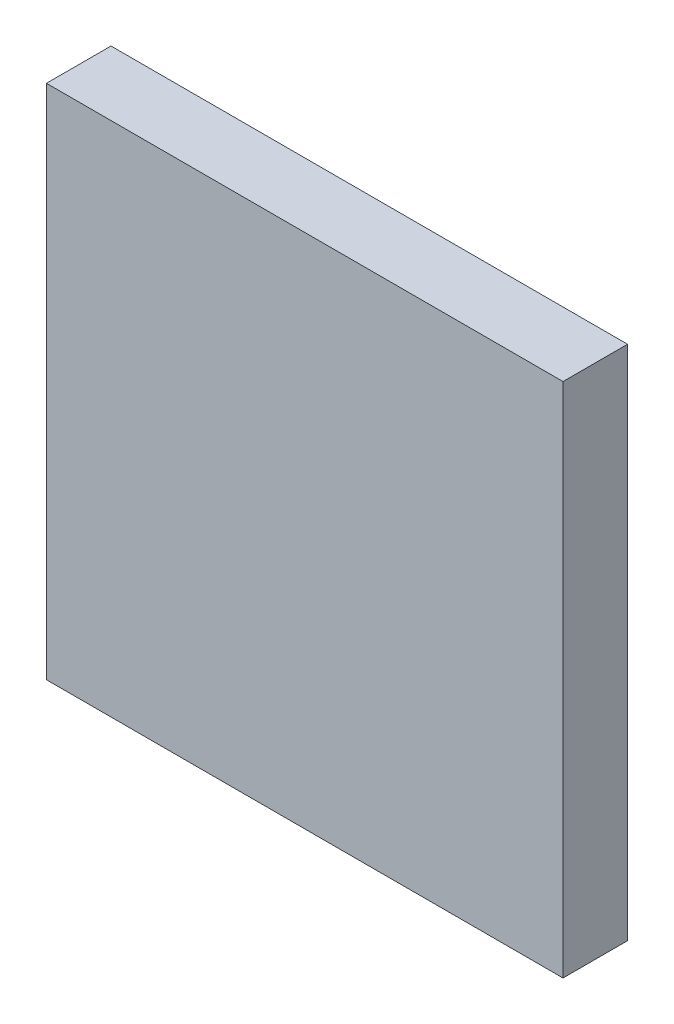
ISO-10303-21;
HEADER;
FILE_DESCRIPTION(('STEP AP214'),'2;1');
FILE_NAME('part.step','',(''),(''),'','','');
FILE_SCHEMA(('AUTOMOTIVE_DESIGN { 1 0 10303 214 1 1 1 1 }'));
ENDSEC;
DATA;
#1=APPLICATION_CONTEXT('core data for automotive mechanical design processes');
#2=APPLICATION_PROTOCOL_DEFINITION('international standard','automotive_design',2000,#1);
#3=PRODUCT_CONTEXT('',#1,'mechanical');
#4=PRODUCT('Part','Part','',(#3));
#5=PRODUCT_RELATED_PRODUCT_CATEGORY('part','',(#4));
#6=PRODUCT_DEFINITION_FORMATION('','',#4);
#7=PRODUCT_DEFINITION_CONTEXT('part definition',#1,'design');
#8=PRODUCT_DEFINITION('design','',#6,#7);
#9=PRODUCT_DEFINITION_SHAPE('','',#8);
#10=(LENGTH_UNIT() NAMED_UNIT(*) SI_UNIT(.MILLI.,.METRE.));
#11=(NAMED_UNIT(*) PLANE_ANGLE_UNIT() SI_UNIT($,.RADIAN.));
#12=(NAMED_UNIT(*) SI_UNIT($,.STERADIAN.) SOLID_ANGLE_UNIT());
#13=UNCERTAINTY_MEASURE_WITH_UNIT(LENGTH_MEASURE(1.E-05),#10,'distance_accuracy_value','');
#14=(GEOMETRIC_REPRESENTATION_CONTEXT(3) GLOBAL_UNCERTAINTY_ASSIGNED_CONTEXT((#13)) GLOBAL_UNIT_ASSIGNED_CONTEXT((#10,
#11,#12)) REPRESENTATION_CONTEXT('',''));
#15=CARTESIAN_POINT('',(0.,0.,0.));
#16=DIRECTION('',(0.,0.,1.));
#17=DIRECTION('',(1.,0.,0.));
#18=AXIS2_PLACEMENT_3D('',#15,#16,#17);
#19=CARTESIAN_POINT('',(0.,0.,3.175));
#20=DIRECTION('',(1.,0.,0.));
#21=DIRECTION('',(0.,0.,-1.));
#22=AXIS2_PLACEMENT_3D('',#19,#20,#21);
#23=PLANE('',#22);
#24=DIRECTION('',(0.,-1.,0.));
#25=VECTOR('',#24,1.);
#26=CARTESIAN_POINT('',(0.,0.,0.));
#27=LINE('',#26,#25);
#28=CARTESIAN_POINT('',(0.,25.4,0.));
#29=VERTEX_POINT('',#28);
#30=CARTESIAN_POINT('',(0.,0.,0.));
#31=VERTEX_POINT('',#30);
#32=EDGE_CURVE('E96',#29,#31,#27,.T.);
#33=ORIENTED_EDGE('',*,*,#32,.T.);
#34=DIRECTION('',(0.,0.,-1.));
#35=VECTOR('',#34,1.);
#36=CARTESIAN_POINT('',(0.,0.,3.175));
#37=LINE('',#36,#35);
#38=CARTESIAN_POINT('',(0.,0.,3.175));
#39=VERTEX_POINT('',#38);
#40=EDGE_CURVE('E11',#39,#31,#37,.T.);
#41=ORIENTED_EDGE('',*,*,#40,.F.);
#42=DIRECTION('',(0.,-1.,0.));
#43=VECTOR('',#42,1.);
#44=CARTESIAN_POINT('',(0.,0.,3.175));
#45=LINE('',#44,#43);
#46=CARTESIAN_POINT('',(0.,25.4,3.175));
#47=VERTEX_POINT('',#46);
#48=EDGE_CURVE('E84',#47,#39,#45,.T.);
#49=ORIENTED_EDGE('',*,*,#48,.F.);
#50=DIRECTION('',(0.,0.,-1.));
#51=VECTOR('',#50,1.);
#52=CARTESIAN_POINT('',(0.,25.4,3.175));
#53=LINE('',#52,#51);
#54=EDGE_CURVE('E92',#47,#29,#53,.T.);
#55=ORIENTED_EDGE('',*,*,#54,.T.);
#56=EDGE_LOOP('',(#33,#41,#49,#55));
#57=FACE_BOUND('',#56,.T.);
#58=ADVANCED_FACE('F33',(#57),#23,.F.);
#59=CARTESIAN_POINT('',(0.,0.,3.175));
#60=DIRECTION('',(0.,1.,0.));
#61=DIRECTION('',(0.,0.,1.));
#62=AXIS2_PLACEMENT_3D('',#59,#60,#61);
#63=PLANE('',#62);
#64=DIRECTION('',(1.,0.,0.));
#65=VECTOR('',#64,1.);
#66=CARTESIAN_POINT('',(0.,0.,0.));
#67=LINE('',#66,#65);
#68=CARTESIAN_POINT('',(25.4,0.,0.));
#69=VERTEX_POINT('',#68);
#70=EDGE_CURVE('E88',#31,#69,#67,.T.);
#71=ORIENTED_EDGE('',*,*,#70,.T.);
#72=DIRECTION('',(0.,0.,-1.));
#73=VECTOR('',#72,1.);
#74=CARTESIAN_POINT('',(25.4,0.,3.175));
#75=LINE('',#74,#73);
#76=CARTESIAN_POINT('',(25.4,0.,3.175));
#77=VERTEX_POINT('',#76);
#78=EDGE_CURVE('E41',#77,#69,#75,.T.);
#79=ORIENTED_EDGE('',*,*,#78,.F.);
#80=DIRECTION('',(1.,0.,0.));
#81=VECTOR('',#80,1.);
#82=CARTESIAN_POINT('',(0.,0.,3.175));
#83=LINE('',#82,#81);
#84=EDGE_CURVE('E79',#39,#77,#83,.T.);
#85=ORIENTED_EDGE('',*,*,#84,.F.);
#86=ORIENTED_EDGE('',*,*,#40,.T.);
#87=EDGE_LOOP('',(#71,#79,#85,#86));
#88=FACE_BOUND('',#87,.T.);
#89=ADVANCED_FACE('F87',(#88),#63,.F.);
#90=CARTESIAN_POINT('',(25.4,0.,3.175));
#91=DIRECTION('',(-1.,0.,0.));
#92=DIRECTION('',(0.,-1.,0.));
#93=AXIS2_PLACEMENT_3D('',#90,#91,#92);
#94=PLANE('',#93);
#95=DIRECTION('',(0.,1.,0.));
#96=VECTOR('',#95,1.);
#97=CARTESIAN_POINT('',(25.4,0.,0.));
#98=LINE('',#97,#96);
#99=CARTESIAN_POINT('',(25.4,25.4,0.));
#100=VERTEX_POINT('',#99);
#101=EDGE_CURVE('E66',#69,#100,#98,.T.);
#102=ORIENTED_EDGE('',*,*,#101,.T.);
#103=DIRECTION('',(0.,0.,-1.));
#104=VECTOR('',#103,1.);
#105=CARTESIAN_POINT('',(25.4,25.4,3.175));
#106=LINE('',#105,#104);
#107=CARTESIAN_POINT('',(25.4,25.4,3.175));
#108=VERTEX_POINT('',#107);
#109=EDGE_CURVE('E89',#108,#100,#106,.T.);
#110=ORIENTED_EDGE('',*,*,#109,.F.);
#111=DIRECTION('',(0.,1.,0.));
#112=VECTOR('',#111,1.);
#113=CARTESIAN_POINT('',(25.4,0.,3.175));
#114=LINE('',#113,#112);
#115=EDGE_CURVE('E82',#77,#108,#114,.T.);
#116=ORIENTED_EDGE('',*,*,#115,.F.);
#117=ORIENTED_EDGE('',*,*,#78,.T.);
#118=EDGE_LOOP('',(#102,#110,#116,#117));
#119=FACE_BOUND('',#118,.T.);
#120=ADVANCED_FACE('F90',(#119),#94,.F.);
#121=CARTESIAN_POINT('',(0.,25.4,3.175));
#122=DIRECTION('',(0.,-1.,0.));
#123=DIRECTION('',(0.,0.,-1.));
#124=AXIS2_PLACEMENT_3D('',#121,#122,#123);
#125=PLANE('',#124);
#126=DIRECTION('',(-1.,0.,0.));
#127=VECTOR('',#126,1.);
#128=CARTESIAN_POINT('',(0.,25.4,0.));
#129=LINE('',#128,#127);
#130=EDGE_CURVE('E72',#100,#29,#129,.T.);
#131=ORIENTED_EDGE('',*,*,#130,.T.);
#132=ORIENTED_EDGE('',*,*,#54,.F.);
#133=DIRECTION('',(-1.,0.,0.));
#134=VECTOR('',#133,1.);
#135=CARTESIAN_POINT('',(0.,25.4,3.175));
#136=LINE('',#135,#134);
#137=EDGE_CURVE('E49',#108,#47,#136,.T.);
#138=ORIENTED_EDGE('',*,*,#137,.F.);
#139=ORIENTED_EDGE('',*,*,#109,.T.);
#140=EDGE_LOOP('',(#131,#132,#138,#139));
#141=FACE_BOUND('',#140,.T.);
#142=ADVANCED_FACE('F103',(#141),#125,.F.);
#143=CARTESIAN_POINT('',(0.,0.,3.175));
#144=DIRECTION('',(0.,0.,-1.));
#145=DIRECTION('',(-1.,0.,0.));
#146=AXIS2_PLACEMENT_3D('',#143,#144,#145);
#147=PLANE('',#146);
#148=ORIENTED_EDGE('',*,*,#48,.T.);
#149=ORIENTED_EDGE('',*,*,#84,.T.);
#150=ORIENTED_EDGE('',*,*,#115,.T.);
#151=ORIENTED_EDGE('',*,*,#137,.T.);
#152=EDGE_LOOP('',(#148,#149,#150,#151));
#153=FACE_BOUND('',#152,.T.);
#154=ADVANCED_FACE('F80',(#153),#147,.F.);
#155=CARTESIAN_POINT('',(0.,0.,0.));
#156=DIRECTION('',(0.,0.,-1.));
#157=DIRECTION('',(-1.,0.,0.));
#158=AXIS2_PLACEMENT_3D('',#155,#156,#157);
#159=PLANE('',#158);
#160=ORIENTED_EDGE('',*,*,#32,.F.);
#161=ORIENTED_EDGE('',*,*,#130,.F.);
#162=ORIENTED_EDGE('',*,*,#101,.F.);
#163=ORIENTED_EDGE('',*,*,#70,.F.);
#164=EDGE_LOOP('',(#160,#161,#162,#163));
#165=FACE_BOUND('',#164,.T.);
#166=ADVANCED_FACE('F106',(#165),#159,.T.);
#167=CLOSED_SHELL('',(#58,#89,#120,#142,#154,#166));
#168=MANIFOLD_SOLID_BREP('B2',#167);
#169=ADVANCED_BREP_SHAPE_REPRESENTATION('',(#18,#168),#14);
#170=SHAPE_DEFINITION_REPRESENTATION(#9,#169);
ENDSEC;
END-ISO-10303-21;
